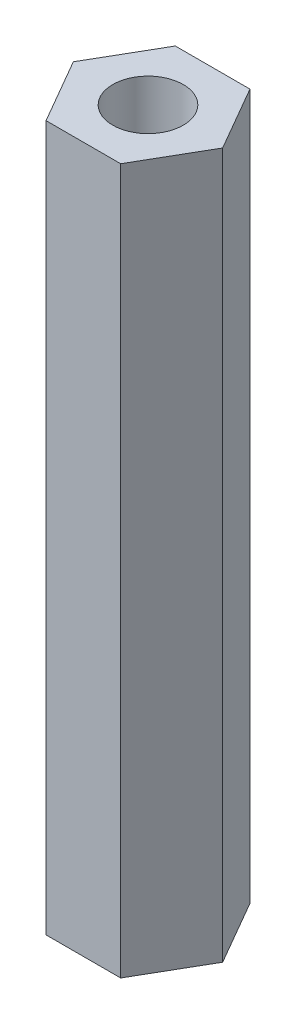
ISO-10303-21;
HEADER;
FILE_DESCRIPTION(('STEP AP214'),'2;1');
FILE_NAME('part.step','',(''),(''),'','','');
FILE_SCHEMA(('AUTOMOTIVE_DESIGN { 1 0 10303 214 1 1 1 1 }'));
ENDSEC;
DATA;
#1=APPLICATION_CONTEXT('core data for automotive mechanical design processes');
#2=APPLICATION_PROTOCOL_DEFINITION('international standard','automotive_design',2000,#1);
#3=PRODUCT_CONTEXT('',#1,'mechanical');
#4=PRODUCT('Part','Part','',(#3));
#5=PRODUCT_RELATED_PRODUCT_CATEGORY('part','',(#4));
#6=PRODUCT_DEFINITION_FORMATION('','',#4);
#7=PRODUCT_DEFINITION_CONTEXT('part definition',#1,'design');
#8=PRODUCT_DEFINITION('design','',#6,#7);
#9=PRODUCT_DEFINITION_SHAPE('','',#8);
#10=(LENGTH_UNIT() NAMED_UNIT(*) SI_UNIT(.MILLI.,.METRE.));
#11=(NAMED_UNIT(*) PLANE_ANGLE_UNIT() SI_UNIT($,.RADIAN.));
#12=(NAMED_UNIT(*) SI_UNIT($,.STERADIAN.) SOLID_ANGLE_UNIT());
#13=UNCERTAINTY_MEASURE_WITH_UNIT(LENGTH_MEASURE(1.E-05),#10,'distance_accuracy_value','');
#14=(GEOMETRIC_REPRESENTATION_CONTEXT(3) GLOBAL_UNCERTAINTY_ASSIGNED_CONTEXT((#13)) GLOBAL_UNIT_ASSIGNED_CONTEXT((#10,
#11,#12)) REPRESENTATION_CONTEXT('',''));
#15=CARTESIAN_POINT('',(0.,0.,0.));
#16=DIRECTION('',(0.,0.,1.));
#17=DIRECTION('',(1.,0.,0.));
#18=AXIS2_PLACEMENT_3D('',#15,#16,#17);
#19=CARTESIAN_POINT('',(0.,30.,0.));
#20=DIRECTION('',(0.,1.,0.));
#21=DIRECTION('',(0.,0.,1.));
#22=AXIS2_PLACEMENT_3D('',#19,#20,#21);
#23=PLANE('',#22);
#24=DIRECTION('',(0.499999999999995,0.,-0.866025403784441));
#25=VECTOR('',#24,1.);
#26=CARTESIAN_POINT('',(1.5877132402715,30.,2.74999999999997));
#27=LINE('',#26,#25);
#28=CARTESIAN_POINT('',(1.5877132402715,30.,2.74999999999997));
#29=VERTEX_POINT('',#28);
#30=CARTESIAN_POINT('',(3.17542648054293,30.,0.));
#31=VERTEX_POINT('',#30);
#32=EDGE_CURVE('E146',#29,#31,#27,.T.);
#33=ORIENTED_EDGE('',*,*,#32,.T.);
#34=DIRECTION('',(-0.500000000000001,0.,-0.866025403784438));
#35=VECTOR('',#34,1.);
#36=CARTESIAN_POINT('',(3.17542648054293,30.,0.));
#37=LINE('',#36,#35);
#38=CARTESIAN_POINT('',(1.58771324027146,30.,-2.74999999999999));
#39=VERTEX_POINT('',#38);
#40=EDGE_CURVE('E94',#31,#39,#37,.T.);
#41=ORIENTED_EDGE('',*,*,#40,.T.);
#42=DIRECTION('',(-1.,0.,0.));
#43=VECTOR('',#42,1.);
#44=CARTESIAN_POINT('',(1.58771324027146,30.,-2.74999999999999));
#45=LINE('',#44,#43);
#46=CARTESIAN_POINT('',(-1.58771324027148,30.,-2.74999999999998));
#47=VERTEX_POINT('',#46);
#48=EDGE_CURVE('E107',#39,#47,#45,.T.);
#49=ORIENTED_EDGE('',*,*,#48,.T.);
#50=DIRECTION('',(-0.499999999999995,0.,0.866025403784442));
#51=VECTOR('',#50,1.);
#52=CARTESIAN_POINT('',(-1.58771324027148,30.,-2.74999999999998));
#53=LINE('',#52,#51);
#54=CARTESIAN_POINT('',(-3.17542648054293,30.,0.));
#55=VERTEX_POINT('',#54);
#56=EDGE_CURVE('E101',#47,#55,#53,.T.);
#57=ORIENTED_EDGE('',*,*,#56,.T.);
#58=DIRECTION('',(0.500000000000007,0.,0.866025403784435));
#59=VECTOR('',#58,1.);
#60=CARTESIAN_POINT('',(-3.17542648054293,30.,0.));
#61=LINE('',#60,#59);
#62=CARTESIAN_POINT('',(-1.58771324027144,30.,2.75));
#63=VERTEX_POINT('',#62);
#64=EDGE_CURVE('E105',#55,#63,#61,.T.);
#65=ORIENTED_EDGE('',*,*,#64,.T.);
#66=DIRECTION('',(1.,0.,0.));
#67=VECTOR('',#66,1.);
#68=CARTESIAN_POINT('',(-1.58771324027144,30.,2.75));
#69=LINE('',#68,#67);
#70=EDGE_CURVE('E57',#63,#29,#69,.T.);
#71=ORIENTED_EDGE('',*,*,#70,.T.);
#72=EDGE_LOOP('',(#33,#41,#49,#57,#65,#71));
#73=FACE_BOUND('',#72,.T.);
#74=CARTESIAN_POINT('',(0.,30.,0.));
#75=DIRECTION('',(0.,1.,0.));
#76=DIRECTION('',(0.,0.,1.));
#77=AXIS2_PLACEMENT_3D('',#74,#75,#76);
#78=CIRCLE('',#77,1.5);
#79=CARTESIAN_POINT('',(0.,30.,1.5));
#80=VERTEX_POINT('',#79);
#81=EDGE_CURVE('E134',#80,#80,#78,.T.);
#82=ORIENTED_EDGE('',*,*,#81,.F.);
#83=EDGE_LOOP('',(#82));
#84=FACE_BOUND('',#83,.T.);
#85=ADVANCED_FACE('F39',(#73,#84),#23,.T.);
#86=CARTESIAN_POINT('',(0.,0.,0.));
#87=DIRECTION('',(0.,1.,0.));
#88=DIRECTION('',(0.,0.,1.));
#89=AXIS2_PLACEMENT_3D('',#86,#87,#88);
#90=PLANE('',#89);
#91=DIRECTION('',(0.499999999999995,0.,-0.866025403784441));
#92=VECTOR('',#91,1.);
#93=CARTESIAN_POINT('',(1.5877132402715,0.,2.74999999999997));
#94=LINE('',#93,#92);
#95=CARTESIAN_POINT('',(1.5877132402715,0.,2.74999999999997));
#96=VERTEX_POINT('',#95);
#97=CARTESIAN_POINT('',(3.17542648054293,0.,0.));
#98=VERTEX_POINT('',#97);
#99=EDGE_CURVE('E129',#96,#98,#94,.T.);
#100=ORIENTED_EDGE('',*,*,#99,.F.);
#101=DIRECTION('',(1.,0.,0.));
#102=VECTOR('',#101,1.);
#103=CARTESIAN_POINT('',(-1.58771324027144,0.,2.75));
#104=LINE('',#103,#102);
#105=CARTESIAN_POINT('',(-1.58771324027144,0.,2.75));
#106=VERTEX_POINT('',#105);
#107=EDGE_CURVE('E86',#106,#96,#104,.T.);
#108=ORIENTED_EDGE('',*,*,#107,.F.);
#109=DIRECTION('',(0.500000000000007,0.,0.866025403784435));
#110=VECTOR('',#109,1.);
#111=CARTESIAN_POINT('',(-3.17542648054293,0.,0.));
#112=LINE('',#111,#110);
#113=CARTESIAN_POINT('',(-3.17542648054293,0.,0.));
#114=VERTEX_POINT('',#113);
#115=EDGE_CURVE('E80',#114,#106,#112,.T.);
#116=ORIENTED_EDGE('',*,*,#115,.F.);
#117=DIRECTION('',(-0.499999999999995,0.,0.866025403784442));
#118=VECTOR('',#117,1.);
#119=CARTESIAN_POINT('',(-1.58771324027148,0.,-2.74999999999998));
#120=LINE('',#119,#118);
#121=CARTESIAN_POINT('',(-1.58771324027148,0.,-2.74999999999998));
#122=VERTEX_POINT('',#121);
#123=EDGE_CURVE('E116',#122,#114,#120,.T.);
#124=ORIENTED_EDGE('',*,*,#123,.F.);
#125=DIRECTION('',(-1.,0.,0.));
#126=VECTOR('',#125,1.);
#127=CARTESIAN_POINT('',(1.58771324027146,0.,-2.74999999999999));
#128=LINE('',#127,#126);
#129=CARTESIAN_POINT('',(1.58771324027146,0.,-2.74999999999999));
#130=VERTEX_POINT('',#129);
#131=EDGE_CURVE('E137',#130,#122,#128,.T.);
#132=ORIENTED_EDGE('',*,*,#131,.F.);
#133=DIRECTION('',(-0.500000000000001,0.,-0.866025403784438));
#134=VECTOR('',#133,1.);
#135=CARTESIAN_POINT('',(3.17542648054293,0.,0.));
#136=LINE('',#135,#134);
#137=EDGE_CURVE('E133',#98,#130,#136,.T.);
#138=ORIENTED_EDGE('',*,*,#137,.F.);
#139=EDGE_LOOP('',(#100,#108,#116,#124,#132,#138));
#140=FACE_BOUND('',#139,.T.);
#141=CARTESIAN_POINT('',(0.,0.,0.));
#142=DIRECTION('',(0.,1.,0.));
#143=DIRECTION('',(0.,0.,1.));
#144=AXIS2_PLACEMENT_3D('',#141,#142,#143);
#145=CIRCLE('',#144,1.5);
#146=CARTESIAN_POINT('',(0.,0.,1.5));
#147=VERTEX_POINT('',#146);
#148=EDGE_CURVE('E243',#147,#147,#145,.T.);
#149=ORIENTED_EDGE('',*,*,#148,.T.);
#150=EDGE_LOOP('',(#149));
#151=FACE_BOUND('',#150,.T.);
#152=ADVANCED_FACE('F159',(#140,#151),#90,.F.);
#153=CARTESIAN_POINT('',(1.5877132402715,30.,2.74999999999997));
#154=DIRECTION('',(-0.866025403784441,0.,-0.499999999999995));
#155=DIRECTION('',(-0.499999999999995,0.,0.866025403784442));
#156=AXIS2_PLACEMENT_3D('',#153,#154,#155);
#157=PLANE('',#156);
#158=ORIENTED_EDGE('',*,*,#99,.T.);
#159=DIRECTION('',(0.,-1.,0.));
#160=VECTOR('',#159,1.);
#161=CARTESIAN_POINT('',(3.17542648054293,30.,0.));
#162=LINE('',#161,#160);
#163=EDGE_CURVE('E11',#31,#98,#162,.T.);
#164=ORIENTED_EDGE('',*,*,#163,.F.);
#165=ORIENTED_EDGE('',*,*,#32,.F.);
#166=DIRECTION('',(0.,-1.,0.));
#167=VECTOR('',#166,1.);
#168=CARTESIAN_POINT('',(1.5877132402715,30.,2.74999999999997));
#169=LINE('',#168,#167);
#170=EDGE_CURVE('E125',#29,#96,#169,.T.);
#171=ORIENTED_EDGE('',*,*,#170,.T.);
#172=EDGE_LOOP('',(#158,#164,#165,#171));
#173=FACE_BOUND('',#172,.T.);
#174=ADVANCED_FACE('F41',(#173),#157,.F.);
#175=CARTESIAN_POINT('',(3.17542648054293,30.,0.));
#176=DIRECTION('',(-0.866025403784438,0.,0.500000000000001));
#177=DIRECTION('',(0.500000000000001,0.,0.866025403784438));
#178=AXIS2_PLACEMENT_3D('',#175,#176,#177);
#179=PLANE('',#178);
#180=ORIENTED_EDGE('',*,*,#137,.T.);
#181=DIRECTION('',(0.,-1.,0.));
#182=VECTOR('',#181,1.);
#183=CARTESIAN_POINT('',(1.58771324027146,30.,-2.74999999999999));
#184=LINE('',#183,#182);
#185=EDGE_CURVE('E49',#39,#130,#184,.T.);
#186=ORIENTED_EDGE('',*,*,#185,.F.);
#187=ORIENTED_EDGE('',*,*,#40,.F.);
#188=ORIENTED_EDGE('',*,*,#163,.T.);
#189=EDGE_LOOP('',(#180,#186,#187,#188));
#190=FACE_BOUND('',#189,.T.);
#191=ADVANCED_FACE('F184',(#190),#179,.F.);
#192=CARTESIAN_POINT('',(1.58771324027146,30.,-2.74999999999999));
#193=DIRECTION('',(0.,0.,1.));
#194=DIRECTION('',(1.,0.,0.));
#195=AXIS2_PLACEMENT_3D('',#192,#193,#194);
#196=PLANE('',#195);
#197=ORIENTED_EDGE('',*,*,#131,.T.);
#198=DIRECTION('',(0.,-1.,0.));
#199=VECTOR('',#198,1.);
#200=CARTESIAN_POINT('',(-1.58771324027148,30.,-2.74999999999998));
#201=LINE('',#200,#199);
#202=EDGE_CURVE('E118',#47,#122,#201,.T.);
#203=ORIENTED_EDGE('',*,*,#202,.F.);
#204=ORIENTED_EDGE('',*,*,#48,.F.);
#205=ORIENTED_EDGE('',*,*,#185,.T.);
#206=EDGE_LOOP('',(#197,#203,#204,#205));
#207=FACE_BOUND('',#206,.T.);
#208=ADVANCED_FACE('F156',(#207),#196,.F.);
#209=CARTESIAN_POINT('',(-1.58771324027148,30.,-2.74999999999998));
#210=DIRECTION('',(0.866025403784442,0.,0.499999999999995));
#211=DIRECTION('',(0.499999999999995,0.,-0.866025403784442));
#212=AXIS2_PLACEMENT_3D('',#209,#210,#211);
#213=PLANE('',#212);
#214=ORIENTED_EDGE('',*,*,#123,.T.);
#215=DIRECTION('',(0.,-1.,0.));
#216=VECTOR('',#215,1.);
#217=CARTESIAN_POINT('',(-3.17542648054293,30.,0.));
#218=LINE('',#217,#216);
#219=EDGE_CURVE('E113',#55,#114,#218,.T.);
#220=ORIENTED_EDGE('',*,*,#219,.F.);
#221=ORIENTED_EDGE('',*,*,#56,.F.);
#222=ORIENTED_EDGE('',*,*,#202,.T.);
#223=EDGE_LOOP('',(#214,#220,#221,#222));
#224=FACE_BOUND('',#223,.T.);
#225=ADVANCED_FACE('F114',(#224),#213,.F.);
#226=CARTESIAN_POINT('',(-3.17542648054293,30.,0.));
#227=DIRECTION('',(0.866025403784435,0.,-0.500000000000007));
#228=DIRECTION('',(-0.500000000000007,0.,-0.866025403784435));
#229=AXIS2_PLACEMENT_3D('',#226,#227,#228);
#230=PLANE('',#229);
#231=ORIENTED_EDGE('',*,*,#115,.T.);
#232=DIRECTION('',(0.,-1.,0.));
#233=VECTOR('',#232,1.);
#234=CARTESIAN_POINT('',(-1.58771324027144,30.,2.75));
#235=LINE('',#234,#233);
#236=EDGE_CURVE('E119',#63,#106,#235,.T.);
#237=ORIENTED_EDGE('',*,*,#236,.F.);
#238=ORIENTED_EDGE('',*,*,#64,.F.);
#239=ORIENTED_EDGE('',*,*,#219,.T.);
#240=EDGE_LOOP('',(#231,#237,#238,#239));
#241=FACE_BOUND('',#240,.T.);
#242=ADVANCED_FACE('F121',(#241),#230,.F.);
#243=CARTESIAN_POINT('',(-1.58771324027144,30.,2.75));
#244=DIRECTION('',(0.,0.,-1.));
#245=DIRECTION('',(-1.,0.,0.));
#246=AXIS2_PLACEMENT_3D('',#243,#244,#245);
#247=PLANE('',#246);
#248=ORIENTED_EDGE('',*,*,#107,.T.);
#249=ORIENTED_EDGE('',*,*,#170,.F.);
#250=ORIENTED_EDGE('',*,*,#70,.F.);
#251=ORIENTED_EDGE('',*,*,#236,.T.);
#252=EDGE_LOOP('',(#248,#249,#250,#251));
#253=FACE_BOUND('',#252,.T.);
#254=ADVANCED_FACE('F164',(#253),#247,.F.);
#255=CARTESIAN_POINT('',(0.,30.,0.));
#256=DIRECTION('',(0.,-1.,0.));
#257=DIRECTION('',(0.,0.,-1.));
#258=AXIS2_PLACEMENT_3D('',#255,#256,#257);
#259=CYLINDRICAL_SURFACE('',#258,1.5);
#260=ORIENTED_EDGE('',*,*,#81,.T.);
#261=EDGE_LOOP('',(#260));
#262=FACE_BOUND('',#261,.T.);
#263=ORIENTED_EDGE('',*,*,#148,.F.);
#264=EDGE_LOOP('',(#263));
#265=FACE_BOUND('',#264,.T.);
#266=ADVANCED_FACE('F166',(#262,#265),#259,.F.);
#267=CLOSED_SHELL('',(#85,#152,#174,#191,#208,#225,#242,#254,#266));
#268=MANIFOLD_SOLID_BREP('B2',#267);
#269=ADVANCED_BREP_SHAPE_REPRESENTATION('',(#18,#268),#14);
#270=SHAPE_DEFINITION_REPRESENTATION(#9,#269);
ENDSEC;
END-ISO-10303-21;
